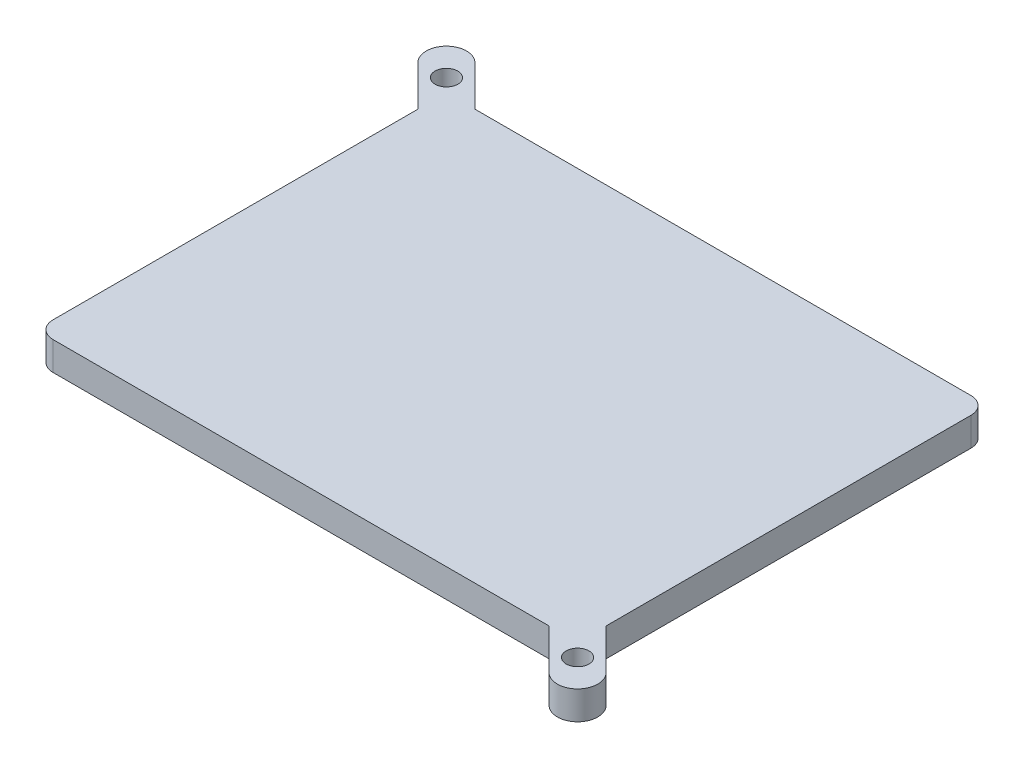
ISO-10303-21;
HEADER;
FILE_DESCRIPTION(('STEP AP214'),'2;1');
FILE_NAME('part.step','',(''),(''),'','','');
FILE_SCHEMA(('AUTOMOTIVE_DESIGN { 1 0 10303 214 1 1 1 1 }'));
ENDSEC;
DATA;
#1=APPLICATION_CONTEXT('core data for automotive mechanical design processes');
#2=APPLICATION_PROTOCOL_DEFINITION('international standard','automotive_design',2000,#1);
#3=PRODUCT_CONTEXT('',#1,'mechanical');
#4=PRODUCT('Part','Part','',(#3));
#5=PRODUCT_RELATED_PRODUCT_CATEGORY('part','',(#4));
#6=PRODUCT_DEFINITION_FORMATION('','',#4);
#7=PRODUCT_DEFINITION_CONTEXT('part definition',#1,'design');
#8=PRODUCT_DEFINITION('design','',#6,#7);
#9=PRODUCT_DEFINITION_SHAPE('','',#8);
#10=(LENGTH_UNIT() NAMED_UNIT(*) SI_UNIT(.MILLI.,.METRE.));
#11=(NAMED_UNIT(*) PLANE_ANGLE_UNIT() SI_UNIT($,.RADIAN.));
#12=(NAMED_UNIT(*) SI_UNIT($,.STERADIAN.) SOLID_ANGLE_UNIT());
#13=UNCERTAINTY_MEASURE_WITH_UNIT(LENGTH_MEASURE(1.E-05),#10,'distance_accuracy_value','');
#14=(GEOMETRIC_REPRESENTATION_CONTEXT(3) GLOBAL_UNCERTAINTY_ASSIGNED_CONTEXT((#13)) GLOBAL_UNIT_ASSIGNED_CONTEXT((#10,
#11,#12)) REPRESENTATION_CONTEXT('',''));
#15=CARTESIAN_POINT('',(0.,0.,0.));
#16=DIRECTION('',(0.,0.,1.));
#17=DIRECTION('',(1.,0.,0.));
#18=AXIS2_PLACEMENT_3D('',#15,#16,#17);
#19=CARTESIAN_POINT('',(-5.60095383026502,5.,5.60095383026502));
#20=DIRECTION('',(0.707106781186547,0.,-0.707106781186548));
#21=DIRECTION('',(-0.707106781186548,0.,-0.707106781186547));
#22=AXIS2_PLACEMENT_3D('',#19,#20,#21);
#23=PLANE('',#22);
#24=DIRECTION('',(0.707106781186548,0.,0.707106781186547));
#25=VECTOR('',#24,1.);
#26=CARTESIAN_POINT('',(-5.60095383026502,0.,5.60095383026502));
#27=LINE('',#26,#25);
#28=CARTESIAN_POINT('',(9.01673598389355,0.,20.2186436444236));
#29=VERTEX_POINT('',#28);
#30=CARTESIAN_POINT('',(16.087803795759,0.,27.289711456289));
#31=VERTEX_POINT('',#30);
#32=EDGE_CURVE('E176',#29,#31,#27,.T.);
#33=ORIENTED_EDGE('',*,*,#32,.T.);
#34=DIRECTION('',(0.,-1.,0.));
#35=VECTOR('',#34,1.);
#36=CARTESIAN_POINT('',(16.087803795759,5.,27.289711456289));
#37=LINE('',#36,#35);
#38=CARTESIAN_POINT('',(16.087803795759,5.,27.289711456289));
#39=VERTEX_POINT('',#38);
#40=EDGE_CURVE('E11',#39,#31,#37,.T.);
#41=ORIENTED_EDGE('',*,*,#40,.F.);
#42=DIRECTION('',(0.707106781186548,0.,0.707106781186547));
#43=VECTOR('',#42,1.);
#44=CARTESIAN_POINT('',(-5.60095383026502,5.,5.60095383026502));
#45=LINE('',#44,#43);
#46=CARTESIAN_POINT('',(9.01673598389355,5.,20.2186436444236));
#47=VERTEX_POINT('',#46);
#48=EDGE_CURVE('E297',#47,#39,#45,.T.);
#49=ORIENTED_EDGE('',*,*,#48,.F.);
#50=DIRECTION('',(0.,-1.,0.));
#51=VECTOR('',#50,1.);
#52=CARTESIAN_POINT('',(9.01673598389355,5.,20.2186436444236));
#53=LINE('',#52,#51);
#54=EDGE_CURVE('E171',#47,#29,#53,.T.);
#55=ORIENTED_EDGE('',*,*,#54,.T.);
#56=EDGE_LOOP('',(#33,#41,#49,#55));
#57=FACE_BOUND('',#56,.T.);
#58=ADVANCED_FACE('F41',(#57),#23,.F.);
#59=CARTESIAN_POINT('',(18.587803795759,5.,24.7897114562891));
#60=DIRECTION('',(0.,-1.,0.));
#61=DIRECTION('',(0.,0.,-1.));
#62=AXIS2_PLACEMENT_3D('',#59,#60,#61);
#63=CYLINDRICAL_SURFACE('',#62,3.53553390593274);
#64=CARTESIAN_POINT('',(18.587803795759,0.,24.7897114562891));
#65=DIRECTION('',(0.,1.,0.));
#66=DIRECTION('',(0.,0.,1.));
#67=AXIS2_PLACEMENT_3D('',#64,#65,#66);
#68=CIRCLE('',#67,3.53553390593274);
#69=CARTESIAN_POINT('',(21.087803795759,0.,22.2897114562891));
#70=VERTEX_POINT('',#69);
#71=EDGE_CURVE('E180',#31,#70,#68,.T.);
#72=ORIENTED_EDGE('',*,*,#71,.T.);
#73=DIRECTION('',(0.,-1.,0.));
#74=VECTOR('',#73,1.);
#75=CARTESIAN_POINT('',(21.087803795759,5.,22.2897114562891));
#76=LINE('',#75,#74);
#77=CARTESIAN_POINT('',(21.087803795759,5.,22.2897114562891));
#78=VERTEX_POINT('',#77);
#79=EDGE_CURVE('E51',#78,#70,#76,.T.);
#80=ORIENTED_EDGE('',*,*,#79,.F.);
#81=CARTESIAN_POINT('',(18.587803795759,5.,24.7897114562891));
#82=DIRECTION('',(0.,1.,0.));
#83=DIRECTION('',(0.,0.,1.));
#84=AXIS2_PLACEMENT_3D('',#81,#82,#83);
#85=CIRCLE('',#84,3.53553390593274);
#86=EDGE_CURVE('E114',#39,#78,#85,.T.);
#87=ORIENTED_EDGE('',*,*,#86,.F.);
#88=ORIENTED_EDGE('',*,*,#40,.T.);
#89=EDGE_LOOP('',(#72,#80,#87,#88));
#90=FACE_BOUND('',#89,.T.);
#91=ADVANCED_FACE('F310',(#90),#63,.T.);
#92=CARTESIAN_POINT('',(-0.600953830265019,5.,0.600953830265019));
#93=DIRECTION('',(-0.707106781186547,0.,0.707106781186548));
#94=DIRECTION('',(0.707106781186548,0.,0.707106781186547));
#95=AXIS2_PLACEMENT_3D('',#92,#93,#94);
#96=PLANE('',#95);
#97=DIRECTION('',(-0.707106781186548,0.,-0.707106781186547));
#98=VECTOR('',#97,1.);
#99=CARTESIAN_POINT('',(-0.600953830265019,0.,0.600953830265019));
#100=LINE('',#99,#98);
#101=CARTESIAN_POINT('',(14.0167359838935,0.,15.2186436444236));
#102=VERTEX_POINT('',#101);
#103=EDGE_CURVE('E183',#70,#102,#100,.T.);
#104=ORIENTED_EDGE('',*,*,#103,.T.);
#105=DIRECTION('',(0.,-1.,0.));
#106=VECTOR('',#105,1.);
#107=CARTESIAN_POINT('',(14.0167359838935,5.,15.2186436444236));
#108=LINE('',#107,#106);
#109=CARTESIAN_POINT('',(14.0167359838935,5.,15.2186436444236));
#110=VERTEX_POINT('',#109);
#111=EDGE_CURVE('E241',#110,#102,#108,.T.);
#112=ORIENTED_EDGE('',*,*,#111,.F.);
#113=DIRECTION('',(-0.707106781186548,0.,-0.707106781186547));
#114=VECTOR('',#113,1.);
#115=CARTESIAN_POINT('',(-0.600953830265019,5.,0.600953830265019));
#116=LINE('',#115,#114);
#117=EDGE_CURVE('E251',#78,#110,#116,.T.);
#118=ORIENTED_EDGE('',*,*,#117,.F.);
#119=ORIENTED_EDGE('',*,*,#79,.T.);
#120=EDGE_LOOP('',(#104,#112,#118,#119));
#121=FACE_BOUND('',#120,.T.);
#122=ADVANCED_FACE('F249',(#121),#96,.F.);
#123=CARTESIAN_POINT('',(14.0167359838935,5.,0.));
#124=DIRECTION('',(-1.,0.,0.));
#125=DIRECTION('',(0.,0.,1.));
#126=AXIS2_PLACEMENT_3D('',#123,#124,#125);
#127=PLANE('',#126);
#128=DIRECTION('',(0.,0.,-1.));
#129=VECTOR('',#128,1.);
#130=CARTESIAN_POINT('',(14.0167359838935,0.,0.));
#131=LINE('',#130,#129);
#132=CARTESIAN_POINT('',(14.0167359838935,0.,-48.7813563555764));
#133=VERTEX_POINT('',#132);
#134=EDGE_CURVE('E186',#102,#133,#131,.T.);
#135=ORIENTED_EDGE('',*,*,#134,.T.);
#136=DIRECTION('',(0.,-1.,0.));
#137=VECTOR('',#136,1.);
#138=CARTESIAN_POINT('',(14.0167359838935,5.,-48.7813563555764));
#139=LINE('',#138,#137);
#140=CARTESIAN_POINT('',(14.0167359838935,5.,-48.7813563555764));
#141=VERTEX_POINT('',#140);
#142=EDGE_CURVE('E238',#141,#133,#139,.T.);
#143=ORIENTED_EDGE('',*,*,#142,.F.);
#144=DIRECTION('',(0.,0.,-1.));
#145=VECTOR('',#144,1.);
#146=CARTESIAN_POINT('',(14.0167359838935,5.,0.));
#147=LINE('',#146,#145);
#148=EDGE_CURVE('E264',#110,#141,#147,.T.);
#149=ORIENTED_EDGE('',*,*,#148,.F.);
#150=ORIENTED_EDGE('',*,*,#111,.T.);
#151=EDGE_LOOP('',(#135,#143,#149,#150));
#152=FACE_BOUND('',#151,.T.);
#153=ADVANCED_FACE('F261',(#152),#127,.F.);
#154=CARTESIAN_POINT('',(11.0167359838935,5.,-48.7813563555764));
#155=DIRECTION('',(0.,-1.,0.));
#156=DIRECTION('',(0.,0.,-1.));
#157=AXIS2_PLACEMENT_3D('',#154,#155,#156);
#158=CYLINDRICAL_SURFACE('',#157,3.);
#159=CARTESIAN_POINT('',(11.0167359838935,0.,-48.7813563555764));
#160=DIRECTION('',(0.,1.,0.));
#161=DIRECTION('',(0.,0.,1.));
#162=AXIS2_PLACEMENT_3D('',#159,#160,#161);
#163=CIRCLE('',#162,3.);
#164=CARTESIAN_POINT('',(11.0167359838935,0.,-51.7813563555764));
#165=VERTEX_POINT('',#164);
#166=EDGE_CURVE('E190',#165,#133,#163,.F.);
#167=ORIENTED_EDGE('',*,*,#166,.F.);
#168=DIRECTION('',(0.,-1.,0.));
#169=VECTOR('',#168,1.);
#170=CARTESIAN_POINT('',(11.0167359838935,5.,-51.7813563555764));
#171=LINE('',#170,#169);
#172=CARTESIAN_POINT('',(11.0167359838935,5.,-51.7813563555764));
#173=VERTEX_POINT('',#172);
#174=EDGE_CURVE('E235',#173,#165,#171,.T.);
#175=ORIENTED_EDGE('',*,*,#174,.F.);
#176=CARTESIAN_POINT('',(11.0167359838935,5.,-48.7813563555764));
#177=DIRECTION('',(0.,1.,0.));
#178=DIRECTION('',(0.,0.,1.));
#179=AXIS2_PLACEMENT_3D('',#176,#177,#178);
#180=CIRCLE('',#179,3.);
#181=EDGE_CURVE('E267',#173,#141,#180,.F.);
#182=ORIENTED_EDGE('',*,*,#181,.T.);
#183=ORIENTED_EDGE('',*,*,#142,.T.);
#184=EDGE_LOOP('',(#167,#175,#182,#183));
#185=FACE_BOUND('',#184,.T.);
#186=ADVANCED_FACE('F320',(#185),#158,.T.);
#187=CARTESIAN_POINT('',(0.,5.,-51.7813563555764));
#188=DIRECTION('',(0.,0.,1.));
#189=DIRECTION('',(1.,0.,0.));
#190=AXIS2_PLACEMENT_3D('',#187,#188,#189);
#191=PLANE('',#190);
#192=DIRECTION('',(-1.,0.,0.));
#193=VECTOR('',#192,1.);
#194=CARTESIAN_POINT('',(0.,0.,-51.7813563555764));
#195=LINE('',#194,#193);
#196=CARTESIAN_POINT('',(-75.9832640161064,0.,-51.7813563555764));
#197=VERTEX_POINT('',#196);
#198=EDGE_CURVE('E194',#165,#197,#195,.T.);
#199=ORIENTED_EDGE('',*,*,#198,.T.);
#200=DIRECTION('',(0.,-1.,0.));
#201=VECTOR('',#200,1.);
#202=CARTESIAN_POINT('',(-75.9832640161064,5.,-51.7813563555764));
#203=LINE('',#202,#201);
#204=CARTESIAN_POINT('',(-75.9832640161064,5.,-51.7813563555764));
#205=VERTEX_POINT('',#204);
#206=EDGE_CURVE('E231',#205,#197,#203,.T.);
#207=ORIENTED_EDGE('',*,*,#206,.F.);
#208=DIRECTION('',(-1.,0.,0.));
#209=VECTOR('',#208,1.);
#210=CARTESIAN_POINT('',(0.,5.,-51.7813563555764));
#211=LINE('',#210,#209);
#212=EDGE_CURVE('E271',#173,#205,#211,.T.);
#213=ORIENTED_EDGE('',*,*,#212,.F.);
#214=ORIENTED_EDGE('',*,*,#174,.T.);
#215=EDGE_LOOP('',(#199,#207,#213,#214));
#216=FACE_BOUND('',#215,.T.);
#217=ADVANCED_FACE('F323',(#216),#191,.F.);
#218=CARTESIAN_POINT('',(-12.100953830265,5.,12.100953830265));
#219=DIRECTION('',(-0.707106781186548,0.,0.707106781186547));
#220=DIRECTION('',(0.707106781186547,0.,0.707106781186548));
#221=AXIS2_PLACEMENT_3D('',#218,#219,#220);
#222=PLANE('',#221);
#223=DIRECTION('',(-0.707106781186547,0.,-0.707106781186548));
#224=VECTOR('',#223,1.);
#225=CARTESIAN_POINT('',(-12.100953830265,0.,12.100953830265));
#226=LINE('',#225,#224);
#227=CARTESIAN_POINT('',(-83.0543318279719,0.,-58.8524241674419));
#228=VERTEX_POINT('',#227);
#229=EDGE_CURVE('E197',#197,#228,#226,.T.);
#230=ORIENTED_EDGE('',*,*,#229,.T.);
#231=DIRECTION('',(0.,-1.,0.));
#232=VECTOR('',#231,1.);
#233=CARTESIAN_POINT('',(-83.0543318279719,5.,-58.8524241674419));
#234=LINE('',#233,#232);
#235=CARTESIAN_POINT('',(-83.0543318279719,5.,-58.8524241674419));
#236=VERTEX_POINT('',#235);
#237=EDGE_CURVE('E227',#236,#228,#234,.T.);
#238=ORIENTED_EDGE('',*,*,#237,.F.);
#239=DIRECTION('',(-0.707106781186547,0.,-0.707106781186548));
#240=VECTOR('',#239,1.);
#241=CARTESIAN_POINT('',(-12.100953830265,5.,12.100953830265));
#242=LINE('',#241,#240);
#243=EDGE_CURVE('E278',#205,#236,#242,.T.);
#244=ORIENTED_EDGE('',*,*,#243,.F.);
#245=ORIENTED_EDGE('',*,*,#206,.T.);
#246=EDGE_LOOP('',(#230,#238,#244,#245));
#247=FACE_BOUND('',#246,.T.);
#248=ADVANCED_FACE('F327',(#247),#222,.F.);
#249=CARTESIAN_POINT('',(-85.5543318279719,5.,-56.3524241674419));
#250=DIRECTION('',(0.,-1.,0.));
#251=DIRECTION('',(0.,0.,-1.));
#252=AXIS2_PLACEMENT_3D('',#249,#250,#251);
#253=CYLINDRICAL_SURFACE('',#252,3.53553390593274);
#254=CARTESIAN_POINT('',(-85.5543318279719,0.,-56.3524241674419));
#255=DIRECTION('',(0.,1.,0.));
#256=DIRECTION('',(0.,0.,1.));
#257=AXIS2_PLACEMENT_3D('',#254,#255,#256);
#258=CIRCLE('',#257,3.53553390593274);
#259=CARTESIAN_POINT('',(-88.0543318279719,0.,-53.8524241674419));
#260=VERTEX_POINT('',#259);
#261=EDGE_CURVE('E200',#228,#260,#258,.T.);
#262=ORIENTED_EDGE('',*,*,#261,.T.);
#263=DIRECTION('',(0.,-1.,0.));
#264=VECTOR('',#263,1.);
#265=CARTESIAN_POINT('',(-88.0543318279719,5.,-53.8524241674419));
#266=LINE('',#265,#264);
#267=CARTESIAN_POINT('',(-88.0543318279719,5.,-53.8524241674419));
#268=VERTEX_POINT('',#267);
#269=EDGE_CURVE('E223',#268,#260,#266,.T.);
#270=ORIENTED_EDGE('',*,*,#269,.F.);
#271=CARTESIAN_POINT('',(-85.5543318279719,5.,-56.3524241674419));
#272=DIRECTION('',(0.,1.,0.));
#273=DIRECTION('',(0.,0.,1.));
#274=AXIS2_PLACEMENT_3D('',#271,#272,#273);
#275=CIRCLE('',#274,3.53553390593274);
#276=EDGE_CURVE('E281',#236,#268,#275,.T.);
#277=ORIENTED_EDGE('',*,*,#276,.F.);
#278=ORIENTED_EDGE('',*,*,#237,.T.);
#279=EDGE_LOOP('',(#262,#270,#277,#278));
#280=FACE_BOUND('',#279,.T.);
#281=ADVANCED_FACE('F289',(#280),#253,.T.);
#282=CARTESIAN_POINT('',(-17.1009538302649,5.,17.1009538302649));
#283=DIRECTION('',(0.707106781186547,0.,-0.707106781186548));
#284=DIRECTION('',(-0.707106781186548,0.,-0.707106781186547));
#285=AXIS2_PLACEMENT_3D('',#282,#283,#284);
#286=PLANE('',#285);
#287=DIRECTION('',(0.707106781186548,0.,0.707106781186547));
#288=VECTOR('',#287,1.);
#289=CARTESIAN_POINT('',(-17.1009538302649,0.,17.1009538302649));
#290=LINE('',#289,#288);
#291=CARTESIAN_POINT('',(-80.9832640161064,0.,-46.7813563555764));
#292=VERTEX_POINT('',#291);
#293=EDGE_CURVE('E203',#260,#292,#290,.T.);
#294=ORIENTED_EDGE('',*,*,#293,.T.);
#295=DIRECTION('',(0.,-1.,0.));
#296=VECTOR('',#295,1.);
#297=CARTESIAN_POINT('',(-80.9832640161064,5.,-46.7813563555764));
#298=LINE('',#297,#296);
#299=CARTESIAN_POINT('',(-80.9832640161064,5.,-46.7813563555764));
#300=VERTEX_POINT('',#299);
#301=EDGE_CURVE('E157',#300,#292,#298,.T.);
#302=ORIENTED_EDGE('',*,*,#301,.F.);
#303=DIRECTION('',(0.707106781186548,0.,0.707106781186547));
#304=VECTOR('',#303,1.);
#305=CARTESIAN_POINT('',(-17.1009538302649,5.,17.1009538302649));
#306=LINE('',#305,#304);
#307=EDGE_CURVE('E146',#268,#300,#306,.T.);
#308=ORIENTED_EDGE('',*,*,#307,.F.);
#309=ORIENTED_EDGE('',*,*,#269,.T.);
#310=EDGE_LOOP('',(#294,#302,#308,#309));
#311=FACE_BOUND('',#310,.T.);
#312=ADVANCED_FACE('F293',(#311),#286,.F.);
#313=CARTESIAN_POINT('',(-80.9832640161064,5.,0.));
#314=DIRECTION('',(1.,0.,0.));
#315=DIRECTION('',(0.,0.,-1.));
#316=AXIS2_PLACEMENT_3D('',#313,#314,#315);
#317=PLANE('',#316);
#318=DIRECTION('',(0.,0.,1.));
#319=VECTOR('',#318,1.);
#320=CARTESIAN_POINT('',(-80.9832640161064,0.,0.));
#321=LINE('',#320,#319);
#322=CARTESIAN_POINT('',(-80.9832640161064,0.,17.2186436444236));
#323=VERTEX_POINT('',#322);
#324=EDGE_CURVE('E155',#292,#323,#321,.T.);
#325=ORIENTED_EDGE('',*,*,#324,.T.);
#326=DIRECTION('',(0.,-1.,0.));
#327=VECTOR('',#326,1.);
#328=CARTESIAN_POINT('',(-80.9832640161064,5.,17.2186436444236));
#329=LINE('',#328,#327);
#330=CARTESIAN_POINT('',(-80.9832640161064,5.,17.2186436444236));
#331=VERTEX_POINT('',#330);
#332=EDGE_CURVE('E152',#331,#323,#329,.T.);
#333=ORIENTED_EDGE('',*,*,#332,.F.);
#334=DIRECTION('',(0.,0.,1.));
#335=VECTOR('',#334,1.);
#336=CARTESIAN_POINT('',(-80.9832640161064,5.,0.));
#337=LINE('',#336,#335);
#338=EDGE_CURVE('E139',#300,#331,#337,.T.);
#339=ORIENTED_EDGE('',*,*,#338,.F.);
#340=ORIENTED_EDGE('',*,*,#301,.T.);
#341=EDGE_LOOP('',(#325,#333,#339,#340));
#342=FACE_BOUND('',#341,.T.);
#343=ADVANCED_FACE('F153',(#342),#317,.F.);
#344=CARTESIAN_POINT('',(-77.9832640161064,5.,17.2186436444236));
#345=DIRECTION('',(0.,-1.,0.));
#346=DIRECTION('',(0.,0.,-1.));
#347=AXIS2_PLACEMENT_3D('',#344,#345,#346);
#348=CYLINDRICAL_SURFACE('',#347,3.);
#349=CARTESIAN_POINT('',(-77.9832640161064,0.,17.2186436444236));
#350=DIRECTION('',(0.,1.,0.));
#351=DIRECTION('',(0.,0.,1.));
#352=AXIS2_PLACEMENT_3D('',#349,#350,#351);
#353=CIRCLE('',#352,3.);
#354=CARTESIAN_POINT('',(-77.9832640161064,0.,20.2186436444236));
#355=VERTEX_POINT('',#354);
#356=EDGE_CURVE('E100',#323,#355,#353,.T.);
#357=ORIENTED_EDGE('',*,*,#356,.T.);
#358=DIRECTION('',(0.,-1.,0.));
#359=VECTOR('',#358,1.);
#360=CARTESIAN_POINT('',(-77.9832640161064,5.,20.2186436444236));
#361=LINE('',#360,#359);
#362=CARTESIAN_POINT('',(-77.9832640161064,5.,20.2186436444236));
#363=VERTEX_POINT('',#362);
#364=EDGE_CURVE('E158',#363,#355,#361,.T.);
#365=ORIENTED_EDGE('',*,*,#364,.F.);
#366=CARTESIAN_POINT('',(-77.9832640161064,5.,17.2186436444236));
#367=DIRECTION('',(0.,1.,0.));
#368=DIRECTION('',(0.,0.,1.));
#369=AXIS2_PLACEMENT_3D('',#366,#367,#368);
#370=CIRCLE('',#369,3.);
#371=EDGE_CURVE('E144',#331,#363,#370,.T.);
#372=ORIENTED_EDGE('',*,*,#371,.F.);
#373=ORIENTED_EDGE('',*,*,#332,.T.);
#374=EDGE_LOOP('',(#357,#365,#372,#373));
#375=FACE_BOUND('',#374,.T.);
#376=ADVANCED_FACE('F160',(#375),#348,.T.);
#377=CARTESIAN_POINT('',(0.,5.,20.2186436444236));
#378=DIRECTION('',(0.,0.,-1.));
#379=DIRECTION('',(-1.,0.,0.));
#380=AXIS2_PLACEMENT_3D('',#377,#378,#379);
#381=PLANE('',#380);
#382=DIRECTION('',(1.,0.,0.));
#383=VECTOR('',#382,1.);
#384=CARTESIAN_POINT('',(0.,0.,20.2186436444236));
#385=LINE('',#384,#383);
#386=EDGE_CURVE('E106',#355,#29,#385,.T.);
#387=ORIENTED_EDGE('',*,*,#386,.T.);
#388=ORIENTED_EDGE('',*,*,#54,.F.);
#389=DIRECTION('',(1.,0.,0.));
#390=VECTOR('',#389,1.);
#391=CARTESIAN_POINT('',(0.,5.,20.2186436444236));
#392=LINE('',#391,#390);
#393=EDGE_CURVE('E59',#363,#47,#392,.T.);
#394=ORIENTED_EDGE('',*,*,#393,.F.);
#395=ORIENTED_EDGE('',*,*,#364,.T.);
#396=EDGE_LOOP('',(#387,#388,#394,#395));
#397=FACE_BOUND('',#396,.T.);
#398=ADVANCED_FACE('F298',(#397),#381,.F.);
#399=CARTESIAN_POINT('',(16.3022698898263,5.,22.5041775503563));
#400=DIRECTION('',(0.,-1.,0.));
#401=DIRECTION('',(0.,0.,-1.));
#402=AXIS2_PLACEMENT_3D('',#399,#400,#401);
#403=CYLINDRICAL_SURFACE('',#402,2.);
#404=CARTESIAN_POINT('',(16.3022698898263,5.,22.5041775503563));
#405=DIRECTION('',(0.,1.,0.));
#406=DIRECTION('',(0.,0.,1.));
#407=AXIS2_PLACEMENT_3D('',#404,#405,#406);
#408=CIRCLE('',#407,2.);
#409=CARTESIAN_POINT('',(16.3022698898263,5.,24.5041775503563));
#410=VERTEX_POINT('',#409);
#411=EDGE_CURVE('E216',#410,#410,#408,.T.);
#412=ORIENTED_EDGE('',*,*,#411,.T.);
#413=EDGE_LOOP('',(#412));
#414=FACE_BOUND('',#413,.T.);
#415=CARTESIAN_POINT('',(16.3022698898263,0.,22.5041775503563));
#416=DIRECTION('',(0.,1.,0.));
#417=DIRECTION('',(0.,0.,1.));
#418=AXIS2_PLACEMENT_3D('',#415,#416,#417);
#419=CIRCLE('',#418,2.);
#420=CARTESIAN_POINT('',(16.3022698898263,0.,24.5041775503563));
#421=VERTEX_POINT('',#420);
#422=EDGE_CURVE('E172',#421,#421,#419,.T.);
#423=ORIENTED_EDGE('',*,*,#422,.F.);
#424=EDGE_LOOP('',(#423));
#425=FACE_BOUND('',#424,.T.);
#426=ADVANCED_FACE('F43',(#414,#425),#403,.F.);
#427=CARTESIAN_POINT('',(-83.2687979220391,5.,-54.0668902615092));
#428=DIRECTION('',(0.,-1.,0.));
#429=DIRECTION('',(0.,0.,-1.));
#430=AXIS2_PLACEMENT_3D('',#427,#428,#429);
#431=CYLINDRICAL_SURFACE('',#430,2.);
#432=CARTESIAN_POINT('',(-83.2687979220391,5.,-54.0668902615092));
#433=DIRECTION('',(0.,1.,0.));
#434=DIRECTION('',(0.,0.,1.));
#435=AXIS2_PLACEMENT_3D('',#432,#433,#434);
#436=CIRCLE('',#435,2.);
#437=CARTESIAN_POINT('',(-83.2687979220391,5.,-52.0668902615092));
#438=VERTEX_POINT('',#437);
#439=EDGE_CURVE('E164',#438,#438,#436,.T.);
#440=ORIENTED_EDGE('',*,*,#439,.T.);
#441=EDGE_LOOP('',(#440));
#442=FACE_BOUND('',#441,.T.);
#443=CARTESIAN_POINT('',(-83.2687979220391,0.,-54.0668902615092));
#444=DIRECTION('',(0.,1.,0.));
#445=DIRECTION('',(0.,0.,1.));
#446=AXIS2_PLACEMENT_3D('',#443,#444,#445);
#447=CIRCLE('',#446,2.);
#448=CARTESIAN_POINT('',(-83.2687979220391,0.,-52.0668902615092));
#449=VERTEX_POINT('',#448);
#450=EDGE_CURVE('E212',#449,#449,#447,.T.);
#451=ORIENTED_EDGE('',*,*,#450,.F.);
#452=EDGE_LOOP('',(#451));
#453=FACE_BOUND('',#452,.T.);
#454=ADVANCED_FACE('F305',(#442,#453),#431,.F.);
#455=CARTESIAN_POINT('',(0.,5.,0.));
#456=DIRECTION('',(0.,1.,0.));
#457=DIRECTION('',(0.,0.,1.));
#458=AXIS2_PLACEMENT_3D('',#455,#456,#457);
#459=PLANE('',#458);
#460=ORIENTED_EDGE('',*,*,#411,.F.);
#461=EDGE_LOOP('',(#460));
#462=FACE_BOUND('',#461,.T.);
#463=ORIENTED_EDGE('',*,*,#48,.T.);
#464=ORIENTED_EDGE('',*,*,#86,.T.);
#465=ORIENTED_EDGE('',*,*,#117,.T.);
#466=ORIENTED_EDGE('',*,*,#148,.T.);
#467=ORIENTED_EDGE('',*,*,#181,.F.);
#468=ORIENTED_EDGE('',*,*,#212,.T.);
#469=ORIENTED_EDGE('',*,*,#243,.T.);
#470=ORIENTED_EDGE('',*,*,#276,.T.);
#471=ORIENTED_EDGE('',*,*,#307,.T.);
#472=ORIENTED_EDGE('',*,*,#338,.T.);
#473=ORIENTED_EDGE('',*,*,#371,.T.);
#474=ORIENTED_EDGE('',*,*,#393,.T.);
#475=EDGE_LOOP('',(#463,#464,#465,#466,#467,#468,#469,#470,#471,#472,#473,#474));
#476=FACE_BOUND('',#475,.T.);
#477=ORIENTED_EDGE('',*,*,#439,.F.);
#478=EDGE_LOOP('',(#477));
#479=FACE_BOUND('',#478,.T.);
#480=ADVANCED_FACE('F141',(#462,#476,#479),#459,.T.);
#481=CARTESIAN_POINT('',(0.,0.,0.));
#482=DIRECTION('',(0.,1.,0.));
#483=DIRECTION('',(0.,0.,1.));
#484=AXIS2_PLACEMENT_3D('',#481,#482,#483);
#485=PLANE('',#484);
#486=ORIENTED_EDGE('',*,*,#422,.T.);
#487=EDGE_LOOP('',(#486));
#488=FACE_BOUND('',#487,.T.);
#489=ORIENTED_EDGE('',*,*,#32,.F.);
#490=ORIENTED_EDGE('',*,*,#386,.F.);
#491=ORIENTED_EDGE('',*,*,#356,.F.);
#492=ORIENTED_EDGE('',*,*,#324,.F.);
#493=ORIENTED_EDGE('',*,*,#293,.F.);
#494=ORIENTED_EDGE('',*,*,#261,.F.);
#495=ORIENTED_EDGE('',*,*,#229,.F.);
#496=ORIENTED_EDGE('',*,*,#198,.F.);
#497=ORIENTED_EDGE('',*,*,#166,.T.);
#498=ORIENTED_EDGE('',*,*,#134,.F.);
#499=ORIENTED_EDGE('',*,*,#103,.F.);
#500=ORIENTED_EDGE('',*,*,#71,.F.);
#501=EDGE_LOOP('',(#489,#490,#491,#492,#493,#494,#495,#496,#497,#498,#499,#500));
#502=FACE_BOUND('',#501,.T.);
#503=ORIENTED_EDGE('',*,*,#450,.T.);
#504=EDGE_LOOP('',(#503));
#505=FACE_BOUND('',#504,.T.);
#506=ADVANCED_FACE('F255',(#488,#502,#505),#485,.F.);
#507=CLOSED_SHELL('',(#58,#91,#122,#153,#186,#217,#248,#281,#312,#343,#376,#398,#426,#454,#480,#506));
#508=MANIFOLD_SOLID_BREP('B2',#507);
#509=ADVANCED_BREP_SHAPE_REPRESENTATION('',(#18,#508),#14);
#510=SHAPE_DEFINITION_REPRESENTATION(#9,#509);
ENDSEC;
END-ISO-10303-21;
